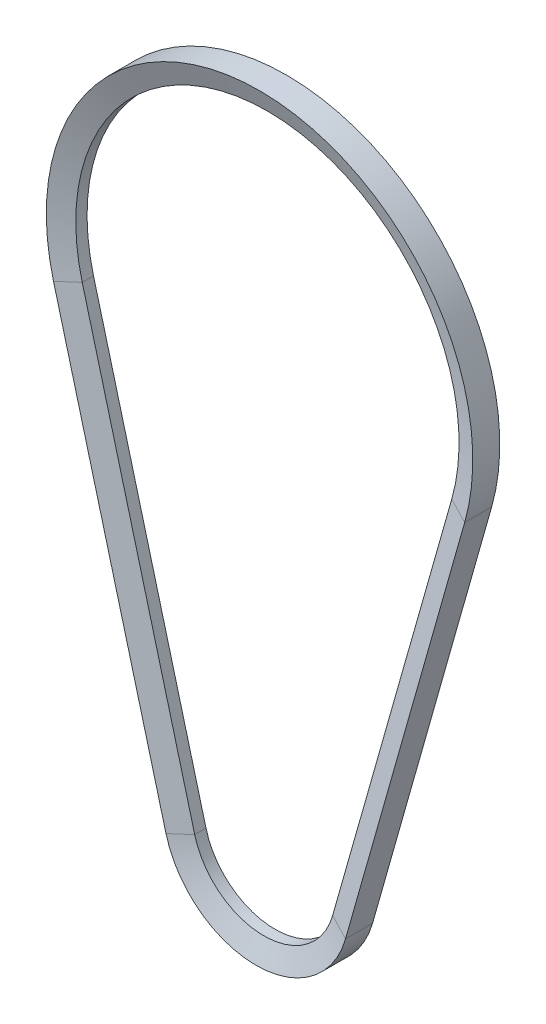
ISO-10303-21;
HEADER;
FILE_DESCRIPTION(('STEP AP214'),'2;1');
FILE_NAME('part.step','',(''),(''),'','','');
FILE_SCHEMA(('AUTOMOTIVE_DESIGN { 1 0 10303 214 1 1 1 1 }'));
ENDSEC;
DATA;
#1=APPLICATION_CONTEXT('core data for automotive mechanical design processes');
#2=APPLICATION_PROTOCOL_DEFINITION('international standard','automotive_design',2000,#1);
#3=PRODUCT_CONTEXT('',#1,'mechanical');
#4=PRODUCT('Part','Part','',(#3));
#5=PRODUCT_RELATED_PRODUCT_CATEGORY('part','',(#4));
#6=PRODUCT_DEFINITION_FORMATION('','',#4);
#7=PRODUCT_DEFINITION_CONTEXT('part definition',#1,'design');
#8=PRODUCT_DEFINITION('design','',#6,#7);
#9=PRODUCT_DEFINITION_SHAPE('','',#8);
#10=(LENGTH_UNIT() NAMED_UNIT(*) SI_UNIT(.MILLI.,.METRE.));
#11=(NAMED_UNIT(*) PLANE_ANGLE_UNIT() SI_UNIT($,.RADIAN.));
#12=(NAMED_UNIT(*) SI_UNIT($,.STERADIAN.) SOLID_ANGLE_UNIT());
#13=UNCERTAINTY_MEASURE_WITH_UNIT(LENGTH_MEASURE(1.E-05),#10,'distance_accuracy_value','');
#14=(GEOMETRIC_REPRESENTATION_CONTEXT(3) GLOBAL_UNCERTAINTY_ASSIGNED_CONTEXT((#13)) GLOBAL_UNIT_ASSIGNED_CONTEXT((#10,
#11,#12)) REPRESENTATION_CONTEXT('',''));
#15=CARTESIAN_POINT('',(0.,0.,0.));
#16=DIRECTION('',(0.,0.,1.));
#17=DIRECTION('',(1.,0.,0.));
#18=AXIS2_PLACEMENT_3D('',#15,#16,#17);
#19=CARTESIAN_POINT('',(-34.6660922371174,-176.694721007079,5.));
#20=DIRECTION('',(-0.966271905975464,-0.257523986693558,0.));
#21=DIRECTION('',(0.257523986693558,-0.966271905975464,0.));
#22=AXIS2_PLACEMENT_3D('',#19,#20,#21);
#23=PLANE('',#22);
#24=DIRECTION('',(-0.257523986693558,0.966271905975464,0.));
#25=VECTOR('',#24,1.);
#26=CARTESIAN_POINT('',(-34.6660922371174,-176.694721007079,-5.));
#27=LINE('',#26,#25);
#28=CARTESIAN_POINT('',(-34.6660922371174,-176.694721007079,-5.));
#29=VERTEX_POINT('',#28);
#30=CARTESIAN_POINT('',(-76.3354805722072,-20.3443949487482,-5.));
#31=VERTEX_POINT('',#30);
#32=EDGE_CURVE('E11',#29,#31,#27,.T.);
#33=ORIENTED_EDGE('',*,*,#32,.F.);
#34=DIRECTION('',(0.,0.,1.));
#35=VECTOR('',#34,1.);
#36=CARTESIAN_POINT('',(-34.6660922371174,-176.694721007079,5.));
#37=LINE('',#36,#35);
#38=CARTESIAN_POINT('',(-34.6660922371174,-176.694721007079,5.));
#39=VERTEX_POINT('',#38);
#40=EDGE_CURVE('E36',#29,#39,#37,.T.);
#41=ORIENTED_EDGE('',*,*,#40,.T.);
#42=DIRECTION('',(-0.257523986693558,0.966271905975464,0.));
#43=VECTOR('',#42,1.);
#44=CARTESIAN_POINT('',(-34.6660922371174,-176.694721007079,5.));
#45=LINE('',#44,#43);
#46=CARTESIAN_POINT('',(-76.3354805722072,-20.3443949487482,5.));
#47=VERTEX_POINT('',#46);
#48=EDGE_CURVE('E112',#39,#47,#45,.T.);
#49=ORIENTED_EDGE('',*,*,#48,.T.);
#50=DIRECTION('',(0.,0.,1.));
#51=VECTOR('',#50,1.);
#52=CARTESIAN_POINT('',(-76.3354805722072,-20.3443949487482,5.));
#53=LINE('',#52,#51);
#54=EDGE_CURVE('E115',#31,#47,#53,.T.);
#55=ORIENTED_EDGE('',*,*,#54,.F.);
#56=EDGE_LOOP('',(#33,#41,#49,#55));
#57=FACE_BOUND('',#56,.T.);
#58=ADVANCED_FACE('F33',(#57),#23,.T.);
#59=CARTESIAN_POINT('',(-34.6660922371174,-176.694721007079,-5.));
#60=DIRECTION('',(0.330484455773292,0.0880783908387274,-0.93969262078591));
#61=DIRECTION('',(-0.943358941661249,0.,-0.33177387960442));
#62=AXIS2_PLACEMENT_3D('',#59,#60,#61);
#63=PLANE('',#62);
#64=DIRECTION('',(-0.257523986693558,0.966271905975464,0.));
#65=VECTOR('',#64,1.);
#66=CARTESIAN_POINT('',(-26.9359169893196,-174.634529113508,-2.08823812587041));
#67=LINE('',#66,#65);
#68=CARTESIAN_POINT('',(-26.9359169893196,-174.634529113508,-2.08823812587041));
#69=VERTEX_POINT('',#68);
#70=CARTESIAN_POINT('',(-68.6053053244094,-18.2842030551778,-2.08823812587041));
#71=VERTEX_POINT('',#70);
#72=EDGE_CURVE('E41',#69,#71,#67,.T.);
#73=ORIENTED_EDGE('',*,*,#72,.F.);
#74=DIRECTION('',(-0.907998579717191,-0.241993389973891,-0.342020143325665));
#75=VECTOR('',#74,1.);
#76=CARTESIAN_POINT('',(-34.6660922371174,-176.694721007079,-5.));
#77=LINE('',#76,#75);
#78=EDGE_CURVE('E185',#69,#29,#77,.T.);
#79=ORIENTED_EDGE('',*,*,#78,.T.);
#80=ORIENTED_EDGE('',*,*,#32,.T.);
#81=DIRECTION('',(-0.907998579717191,-0.241993389973891,-0.342020143325665));
#82=VECTOR('',#81,1.);
#83=CARTESIAN_POINT('',(-76.3354805722072,-20.3443949487482,-5.));
#84=LINE('',#83,#82);
#85=EDGE_CURVE('E139',#71,#31,#84,.T.);
#86=ORIENTED_EDGE('',*,*,#85,.F.);
#87=EDGE_LOOP('',(#73,#79,#80,#86));
#88=FACE_BOUND('',#87,.T.);
#89=ADVANCED_FACE('F224',(#88),#63,.T.);
#90=CARTESIAN_POINT('',(-26.9359169893196,-174.634529113508,-2.08823812587041));
#91=DIRECTION('',(0.966271905975464,0.257523986693558,0.));
#92=DIRECTION('',(-0.257523986693558,0.966271905975464,0.));
#93=AXIS2_PLACEMENT_3D('',#90,#91,#92);
#94=PLANE('',#93);
#95=DIRECTION('',(-0.257523986693558,0.966271905975464,0.));
#96=VECTOR('',#95,1.);
#97=CARTESIAN_POINT('',(-26.9359169893196,-174.634529113508,2.08823812587041));
#98=LINE('',#97,#96);
#99=CARTESIAN_POINT('',(-26.9359169893196,-174.634529113508,2.08823812587041));
#100=VERTEX_POINT('',#99);
#101=CARTESIAN_POINT('',(-68.6053053244094,-18.2842030551778,2.08823812587041));
#102=VERTEX_POINT('',#101);
#103=EDGE_CURVE('E121',#100,#102,#98,.T.);
#104=ORIENTED_EDGE('',*,*,#103,.F.);
#105=DIRECTION('',(0.,0.,-1.));
#106=VECTOR('',#105,1.);
#107=CARTESIAN_POINT('',(-26.9359169893196,-174.634529113508,-2.08823812587041));
#108=LINE('',#107,#106);
#109=EDGE_CURVE('E166',#100,#69,#108,.T.);
#110=ORIENTED_EDGE('',*,*,#109,.T.);
#111=ORIENTED_EDGE('',*,*,#72,.T.);
#112=DIRECTION('',(0.,0.,-1.));
#113=VECTOR('',#112,1.);
#114=CARTESIAN_POINT('',(-68.6053053244094,-18.2842030551778,-2.08823812587041));
#115=LINE('',#114,#113);
#116=EDGE_CURVE('E143',#102,#71,#115,.T.);
#117=ORIENTED_EDGE('',*,*,#116,.F.);
#118=EDGE_LOOP('',(#104,#110,#111,#117));
#119=FACE_BOUND('',#118,.T.);
#120=ADVANCED_FACE('F228',(#119),#94,.T.);
#121=CARTESIAN_POINT('',(-1.3297114809705,-167.810143466126,0.));
#122=DIRECTION('',(0.,0.,-1.));
#123=DIRECTION('',(-1.,0.,0.));
#124=AXIS2_PLACEMENT_3D('',#121,#122,#123);
#125=CYLINDRICAL_SURFACE('',#124,34.5);
#126=ORIENTED_EDGE('',*,*,#40,.F.);
#127=CARTESIAN_POINT('',(-1.3297114809705,-167.810143466126,-5.));
#128=DIRECTION('',(0.,0.,-1.));
#129=DIRECTION('',(0.962069638034571,-0.272803980124977,0.));
#130=AXIS2_PLACEMENT_3D('',#127,#128,#129);
#131=CIRCLE('',#130,34.5);
#132=CARTESIAN_POINT('',(31.8616910315054,-177.221880780518,-5.));
#133=VERTEX_POINT('',#132);
#134=EDGE_CURVE('E194',#133,#29,#131,.T.);
#135=ORIENTED_EDGE('',*,*,#134,.F.);
#136=DIRECTION('',(0.,0.,1.));
#137=VECTOR('',#136,1.);
#138=CARTESIAN_POINT('',(31.8616910312222,-177.221880780438,5.));
#139=LINE('',#138,#137);
#140=CARTESIAN_POINT('',(31.8616910315054,-177.221880780518,5.));
#141=VERTEX_POINT('',#140);
#142=EDGE_CURVE('E169',#133,#141,#139,.T.);
#143=ORIENTED_EDGE('',*,*,#142,.T.);
#144=CARTESIAN_POINT('',(-1.3297114809705,-167.810143466126,5.));
#145=DIRECTION('',(0.,0.,-1.));
#146=DIRECTION('',(0.962069638034571,-0.272803980124977,0.));
#147=AXIS2_PLACEMENT_3D('',#144,#145,#146);
#148=CIRCLE('',#147,34.5);
#149=EDGE_CURVE('E163',#141,#39,#148,.T.);
#150=ORIENTED_EDGE('',*,*,#149,.T.);
#151=EDGE_LOOP('',(#126,#135,#143,#150));
#152=FACE_BOUND('',#151,.T.);
#153=ADVANCED_FACE('F201',(#152),#125,.T.);
#154=CARTESIAN_POINT('',(-1.3297114809705,-167.810143466126,-2.08823812587041));
#155=DIRECTION('',(0.,0.,-1.));
#156=DIRECTION('',(-1.,0.,0.));
#157=AXIS2_PLACEMENT_3D('',#154,#155,#156);
#158=CONICAL_SURFACE('',#157,26.5,1.22173047639603);
#159=ORIENTED_EDGE('',*,*,#134,.T.);
#160=ORIENTED_EDGE('',*,*,#78,.F.);
#161=CARTESIAN_POINT('',(-1.3297114809705,-167.810143466126,-2.08823812587041));
#162=DIRECTION('',(0.,0.,-1.));
#163=DIRECTION('',(0.962069638034398,-0.272803980125589,0.));
#164=AXIS2_PLACEMENT_3D('',#161,#162,#163);
#165=CIRCLE('',#164,26.5);
#166=CARTESIAN_POINT('',(24.1651339272243,-175.039448939535,-2.08823812587041));
#167=VERTEX_POINT('',#166);
#168=EDGE_CURVE('E182',#167,#69,#165,.T.);
#169=ORIENTED_EDGE('',*,*,#168,.F.);
#170=DIRECTION('',(0.904049739543798,-0.256351887042563,-0.342020143325665));
#171=VECTOR('',#170,1.);
#172=CARTESIAN_POINT('',(31.8616910312222,-177.221880780438,-5.));
#173=LINE('',#172,#171);
#174=EDGE_CURVE('E178',#167,#133,#173,.T.);
#175=ORIENTED_EDGE('',*,*,#174,.T.);
#176=EDGE_LOOP('',(#159,#160,#169,#175));
#177=FACE_BOUND('',#176,.T.);
#178=ADVANCED_FACE('F237',(#177),#158,.F.);
#179=CARTESIAN_POINT('',(-1.3297114809705,-167.810143466126,0.));
#180=DIRECTION('',(0.,0.,-1.));
#181=DIRECTION('',(-1.,0.,0.));
#182=AXIS2_PLACEMENT_3D('',#179,#180,#181);
#183=CYLINDRICAL_SURFACE('',#182,26.5);
#184=ORIENTED_EDGE('',*,*,#168,.T.);
#185=ORIENTED_EDGE('',*,*,#109,.F.);
#186=CARTESIAN_POINT('',(-1.3297114809705,-167.810143466126,2.08823812587041));
#187=DIRECTION('',(0.,0.,-1.));
#188=DIRECTION('',(0.962069638034398,-0.272803980125589,0.));
#189=AXIS2_PLACEMENT_3D('',#186,#187,#188);
#190=CIRCLE('',#189,26.5);
#191=CARTESIAN_POINT('',(24.1651339272243,-175.039448939535,2.08823812587041));
#192=VERTEX_POINT('',#191);
#193=EDGE_CURVE('E162',#192,#100,#190,.T.);
#194=ORIENTED_EDGE('',*,*,#193,.F.);
#195=DIRECTION('',(0.,0.,-1.));
#196=VECTOR('',#195,1.);
#197=CARTESIAN_POINT('',(24.165133926941,-175.039448939455,-2.08823812587041));
#198=LINE('',#197,#196);
#199=EDGE_CURVE('E155',#192,#167,#198,.T.);
#200=ORIENTED_EDGE('',*,*,#199,.T.);
#201=EDGE_LOOP('',(#184,#185,#194,#200));
#202=FACE_BOUND('',#201,.T.);
#203=ADVANCED_FACE('F209',(#202),#183,.F.);
#204=CARTESIAN_POINT('',(-1.3297114809705,-167.810143466126,5.));
#205=DIRECTION('',(0.,0.,1.));
#206=DIRECTION('',(1.,0.,0.));
#207=AXIS2_PLACEMENT_3D('',#204,#205,#206);
#208=CONICAL_SURFACE('',#207,34.5,1.22173047639603);
#209=ORIENTED_EDGE('',*,*,#193,.T.);
#210=DIRECTION('',(0.907998579717191,0.241993389973891,-0.342020143325666));
#211=VECTOR('',#210,1.);
#212=CARTESIAN_POINT('',(-26.9359169893196,-174.634529113508,2.08823812587041));
#213=LINE('',#212,#211);
#214=EDGE_CURVE('E160',#39,#100,#213,.T.);
#215=ORIENTED_EDGE('',*,*,#214,.F.);
#216=ORIENTED_EDGE('',*,*,#149,.F.);
#217=DIRECTION('',(-0.904049739543798,0.256351887042563,-0.342020143325666));
#218=VECTOR('',#217,1.);
#219=CARTESIAN_POINT('',(24.165133926941,-175.039448939455,2.08823812587041));
#220=LINE('',#219,#218);
#221=EDGE_CURVE('E152',#141,#192,#220,.T.);
#222=ORIENTED_EDGE('',*,*,#221,.T.);
#223=EDGE_LOOP('',(#209,#215,#216,#222));
#224=FACE_BOUND('',#223,.T.);
#225=ADVANCED_FACE('F206',(#224),#208,.F.);
#226=CARTESIAN_POINT('',(76.0035014048183,-21.5515144300409,5.));
#227=DIRECTION('',(0.962069638034369,-0.272803980125692,0.));
#228=DIRECTION('',(0.272803980125692,0.962069638034369,0.));
#229=AXIS2_PLACEMENT_3D('',#226,#227,#228);
#230=PLANE('',#229);
#231=ORIENTED_EDGE('',*,*,#142,.F.);
#232=DIRECTION('',(-0.272803980125692,-0.962069638034369,0.));
#233=VECTOR('',#232,1.);
#234=CARTESIAN_POINT('',(76.0035014048183,-21.5515144300409,-5.));
#235=LINE('',#234,#233);
#236=CARTESIAN_POINT('',(76.0035014045351,-21.5515144299606,-5.));
#237=VERTEX_POINT('',#236);
#238=EDGE_CURVE('E77',#237,#133,#235,.T.);
#239=ORIENTED_EDGE('',*,*,#238,.F.);
#240=DIRECTION('',(0.,0.,1.));
#241=VECTOR('',#240,1.);
#242=CARTESIAN_POINT('',(76.0035014048183,-21.5515144300409,5.));
#243=LINE('',#242,#241);
#244=CARTESIAN_POINT('',(76.0035014045351,-21.5515144299606,5.));
#245=VERTEX_POINT('',#244);
#246=EDGE_CURVE('E159',#237,#245,#243,.T.);
#247=ORIENTED_EDGE('',*,*,#246,.T.);
#248=DIRECTION('',(-0.272803980125692,-0.962069638034369,0.));
#249=VECTOR('',#248,1.);
#250=CARTESIAN_POINT('',(76.0035014048183,-21.5515144300409,5.));
#251=LINE('',#250,#249);
#252=EDGE_CURVE('E157',#245,#141,#251,.T.);
#253=ORIENTED_EDGE('',*,*,#252,.T.);
#254=EDGE_LOOP('',(#231,#239,#247,#253));
#255=FACE_BOUND('',#254,.T.);
#256=ADVANCED_FACE('F219',(#255),#230,.T.);
#257=CARTESIAN_POINT('',(76.0035014048183,-21.5515144300409,-5.));
#258=DIRECTION('',(-0.329047195489786,0.0933044563824011,-0.93969262078591));
#259=DIRECTION('',(-0.943809874285112,0.,0.330488912373654));
#260=AXIS2_PLACEMENT_3D('',#257,#258,#259);
#261=PLANE('',#260);
#262=ORIENTED_EDGE('',*,*,#238,.T.);
#263=ORIENTED_EDGE('',*,*,#174,.F.);
#264=DIRECTION('',(-0.272803980125692,-0.962069638034369,0.));
#265=VECTOR('',#264,1.);
#266=CARTESIAN_POINT('',(68.3069443005371,-19.3690825890573,-2.08823812587041));
#267=LINE('',#266,#265);
#268=CARTESIAN_POINT('',(68.3069443002539,-19.3690825889769,-2.08823812587041));
#269=VERTEX_POINT('',#268);
#270=EDGE_CURVE('E87',#269,#167,#267,.T.);
#271=ORIENTED_EDGE('',*,*,#270,.F.);
#272=DIRECTION('',(0.904049739543798,-0.256351887042563,-0.342020143325665));
#273=VECTOR('',#272,1.);
#274=CARTESIAN_POINT('',(76.0035014048183,-21.5515144300409,-5.));
#275=LINE('',#274,#273);
#276=EDGE_CURVE('E175',#269,#237,#275,.T.);
#277=ORIENTED_EDGE('',*,*,#276,.T.);
#278=EDGE_LOOP('',(#262,#263,#271,#277));
#279=FACE_BOUND('',#278,.T.);
#280=ADVANCED_FACE('F212',(#279),#261,.T.);
#281=CARTESIAN_POINT('',(68.3069443005371,-19.3690825890573,-2.08823812587041));
#282=DIRECTION('',(-0.962069638034369,0.272803980125692,0.));
#283=DIRECTION('',(-0.272803980125692,-0.962069638034369,0.));
#284=AXIS2_PLACEMENT_3D('',#281,#282,#283);
#285=PLANE('',#284);
#286=ORIENTED_EDGE('',*,*,#270,.T.);
#287=ORIENTED_EDGE('',*,*,#199,.F.);
#288=DIRECTION('',(-0.272803980125692,-0.962069638034369,0.));
#289=VECTOR('',#288,1.);
#290=CARTESIAN_POINT('',(68.3069443005371,-19.3690825890573,2.08823812587041));
#291=LINE('',#290,#289);
#292=CARTESIAN_POINT('',(68.3069443002539,-19.3690825889769,2.08823812587041));
#293=VERTEX_POINT('',#292);
#294=EDGE_CURVE('E95',#293,#192,#291,.T.);
#295=ORIENTED_EDGE('',*,*,#294,.F.);
#296=DIRECTION('',(0.,0.,-1.));
#297=VECTOR('',#296,1.);
#298=CARTESIAN_POINT('',(68.3069443005371,-19.3690825890573,-2.08823812587041));
#299=LINE('',#298,#297);
#300=EDGE_CURVE('E150',#293,#269,#299,.T.);
#301=ORIENTED_EDGE('',*,*,#300,.T.);
#302=EDGE_LOOP('',(#286,#287,#295,#301));
#303=FACE_BOUND('',#302,.T.);
#304=ADVANCED_FACE('F210',(#303),#285,.T.);
#305=CARTESIAN_POINT('',(68.3069443005371,-19.3690825890573,2.08823812587041));
#306=DIRECTION('',(-0.329047195489786,0.0933044563824011,0.93969262078591));
#307=DIRECTION('',(0.943809874285112,0.,0.330488912373654));
#308=AXIS2_PLACEMENT_3D('',#305,#306,#307);
#309=PLANE('',#308);
#310=ORIENTED_EDGE('',*,*,#294,.T.);
#311=ORIENTED_EDGE('',*,*,#221,.F.);
#312=ORIENTED_EDGE('',*,*,#252,.F.);
#313=DIRECTION('',(-0.904049739543798,0.256351887042563,-0.342020143325666));
#314=VECTOR('',#313,1.);
#315=CARTESIAN_POINT('',(68.3069443005371,-19.3690825890573,2.08823812587041));
#316=LINE('',#315,#314);
#317=EDGE_CURVE('E131',#245,#293,#316,.T.);
#318=ORIENTED_EDGE('',*,*,#317,.T.);
#319=EDGE_LOOP('',(#310,#311,#312,#318));
#320=FACE_BOUND('',#319,.T.);
#321=ADVANCED_FACE('F204',(#320),#309,.T.);
#322=CARTESIAN_POINT('',(-1.52128309949262E-10,6.7612582199672E-11,0.));
#323=DIRECTION('',(0.,0.,-1.));
#324=DIRECTION('',(-1.,0.,0.));
#325=AXIS2_PLACEMENT_3D('',#322,#323,#324);
#326=CYLINDRICAL_SURFACE('',#325,79.);
#327=ORIENTED_EDGE('',*,*,#246,.F.);
#328=CARTESIAN_POINT('',(-1.52128309949262E-10,6.7612582199672E-11,-5.));
#329=DIRECTION('',(0.,0.,-1.));
#330=DIRECTION('',(-0.966271905975381,-0.257523986693871,0.));
#331=AXIS2_PLACEMENT_3D('',#328,#329,#330);
#332=CIRCLE('',#331,79.);
#333=EDGE_CURVE('E138',#31,#237,#332,.T.);
#334=ORIENTED_EDGE('',*,*,#333,.F.);
#335=ORIENTED_EDGE('',*,*,#54,.T.);
#336=CARTESIAN_POINT('',(-1.52128309949262E-10,6.7612582199672E-11,5.));
#337=DIRECTION('',(0.,0.,-1.));
#338=DIRECTION('',(-0.966271905975381,-0.257523986693871,0.));
#339=AXIS2_PLACEMENT_3D('',#336,#337,#338);
#340=CIRCLE('',#339,79.);
#341=EDGE_CURVE('E127',#47,#245,#340,.T.);
#342=ORIENTED_EDGE('',*,*,#341,.T.);
#343=EDGE_LOOP('',(#327,#334,#335,#342));
#344=FACE_BOUND('',#343,.T.);
#345=ADVANCED_FACE('F136',(#344),#326,.T.);
#346=CARTESIAN_POINT('',(-1.52128309949262E-10,6.7612582199672E-11,-2.08823812587041));
#347=DIRECTION('',(0.,0.,-1.));
#348=DIRECTION('',(-1.,0.,0.));
#349=AXIS2_PLACEMENT_3D('',#346,#347,#348);
#350=CONICAL_SURFACE('',#349,71.,1.22173047639603);
#351=ORIENTED_EDGE('',*,*,#333,.T.);
#352=ORIENTED_EDGE('',*,*,#276,.F.);
#353=CARTESIAN_POINT('',(-1.52128309949262E-10,6.7612582199672E-11,-2.08823812587041));
#354=DIRECTION('',(0.,0.,-1.));
#355=DIRECTION('',(-0.966271905975454,-0.257523986693597,0.));
#356=AXIS2_PLACEMENT_3D('',#353,#354,#355);
#357=CIRCLE('',#356,71.);
#358=EDGE_CURVE('E172',#71,#269,#357,.T.);
#359=ORIENTED_EDGE('',*,*,#358,.F.);
#360=ORIENTED_EDGE('',*,*,#85,.T.);
#361=EDGE_LOOP('',(#351,#352,#359,#360));
#362=FACE_BOUND('',#361,.T.);
#363=ADVANCED_FACE('F240',(#362),#350,.F.);
#364=CARTESIAN_POINT('',(-1.52128309949262E-10,6.7612582199672E-11,0.));
#365=DIRECTION('',(0.,0.,-1.));
#366=DIRECTION('',(-1.,0.,0.));
#367=AXIS2_PLACEMENT_3D('',#364,#365,#366);
#368=CYLINDRICAL_SURFACE('',#367,71.);
#369=ORIENTED_EDGE('',*,*,#358,.T.);
#370=ORIENTED_EDGE('',*,*,#300,.F.);
#371=CARTESIAN_POINT('',(-1.52128309949262E-10,6.7612582199672E-11,2.08823812587041));
#372=DIRECTION('',(0.,0.,-1.));
#373=DIRECTION('',(-0.966271905975454,-0.257523986693597,0.));
#374=AXIS2_PLACEMENT_3D('',#371,#372,#373);
#375=CIRCLE('',#374,71.);
#376=EDGE_CURVE('E149',#102,#293,#375,.T.);
#377=ORIENTED_EDGE('',*,*,#376,.F.);
#378=ORIENTED_EDGE('',*,*,#116,.T.);
#379=EDGE_LOOP('',(#369,#370,#377,#378));
#380=FACE_BOUND('',#379,.T.);
#381=ADVANCED_FACE('F254',(#380),#368,.F.);
#382=CARTESIAN_POINT('',(-1.52128309949262E-10,6.7612582199672E-11,5.));
#383=DIRECTION('',(0.,0.,1.));
#384=DIRECTION('',(1.,0.,0.));
#385=AXIS2_PLACEMENT_3D('',#382,#383,#384);
#386=CONICAL_SURFACE('',#385,79.,1.22173047639603);
#387=ORIENTED_EDGE('',*,*,#376,.T.);
#388=ORIENTED_EDGE('',*,*,#317,.F.);
#389=ORIENTED_EDGE('',*,*,#341,.F.);
#390=DIRECTION('',(0.907998579717191,0.241993389973891,-0.342020143325666));
#391=VECTOR('',#390,1.);
#392=CARTESIAN_POINT('',(-68.6053053244094,-18.2842030551778,2.08823812587041));
#393=LINE('',#392,#391);
#394=EDGE_CURVE('E130',#47,#102,#393,.T.);
#395=ORIENTED_EDGE('',*,*,#394,.T.);
#396=EDGE_LOOP('',(#387,#388,#389,#395));
#397=FACE_BOUND('',#396,.T.);
#398=ADVANCED_FACE('F129',(#397),#386,.F.);
#399=CARTESIAN_POINT('',(-26.9359169893196,-174.634529113508,2.08823812587041));
#400=DIRECTION('',(0.330484455773292,0.0880783908387275,0.93969262078591));
#401=DIRECTION('',(0.943358941661249,0.,-0.331773879604421));
#402=AXIS2_PLACEMENT_3D('',#399,#400,#401);
#403=PLANE('',#402);
#404=ORIENTED_EDGE('',*,*,#214,.T.);
#405=ORIENTED_EDGE('',*,*,#103,.T.);
#406=ORIENTED_EDGE('',*,*,#394,.F.);
#407=ORIENTED_EDGE('',*,*,#48,.F.);
#408=EDGE_LOOP('',(#404,#405,#406,#407));
#409=FACE_BOUND('',#408,.T.);
#410=ADVANCED_FACE('F141',(#409),#403,.T.);
#411=CLOSED_SHELL('',(#58,#89,#120,#153,#178,#203,#225,#256,#280,#304,#321,#345,#363,#381,#398,#410));
#412=MANIFOLD_SOLID_BREP('B2',#411);
#413=ADVANCED_BREP_SHAPE_REPRESENTATION('',(#18,#412),#14);
#414=SHAPE_DEFINITION_REPRESENTATION(#9,#413);
ENDSEC;
END-ISO-10303-21;
